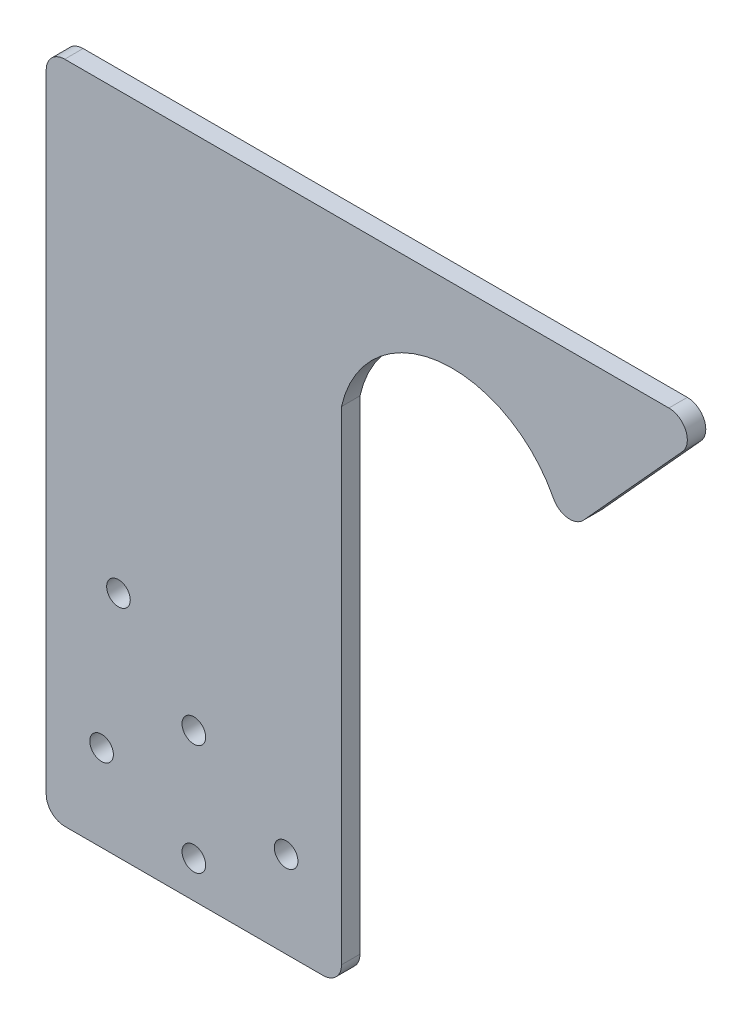
ISO-10303-21;
HEADER;
FILE_DESCRIPTION(('STEP AP214'),'2;1');
FILE_NAME('part.step','',(''),(''),'','','');
FILE_SCHEMA(('AUTOMOTIVE_DESIGN { 1 0 10303 214 1 1 1 1 }'));
ENDSEC;
DATA;
#1=APPLICATION_CONTEXT('core data for automotive mechanical design processes');
#2=APPLICATION_PROTOCOL_DEFINITION('international standard','automotive_design',2000,#1);
#3=PRODUCT_CONTEXT('',#1,'mechanical');
#4=PRODUCT('Part','Part','',(#3));
#5=PRODUCT_RELATED_PRODUCT_CATEGORY('part','',(#4));
#6=PRODUCT_DEFINITION_FORMATION('','',#4);
#7=PRODUCT_DEFINITION_CONTEXT('part definition',#1,'design');
#8=PRODUCT_DEFINITION('design','',#6,#7);
#9=PRODUCT_DEFINITION_SHAPE('','',#8);
#10=(LENGTH_UNIT() NAMED_UNIT(*) SI_UNIT(.MILLI.,.METRE.));
#11=(NAMED_UNIT(*) PLANE_ANGLE_UNIT() SI_UNIT($,.RADIAN.));
#12=(NAMED_UNIT(*) SI_UNIT($,.STERADIAN.) SOLID_ANGLE_UNIT());
#13=UNCERTAINTY_MEASURE_WITH_UNIT(LENGTH_MEASURE(1.E-05),#10,'distance_accuracy_value','');
#14=(GEOMETRIC_REPRESENTATION_CONTEXT(3) GLOBAL_UNCERTAINTY_ASSIGNED_CONTEXT((#13)) GLOBAL_UNIT_ASSIGNED_CONTEXT((#10,
#11,#12)) REPRESENTATION_CONTEXT('',''));
#15=CARTESIAN_POINT('',(0.,0.,0.));
#16=DIRECTION('',(0.,0.,1.));
#17=DIRECTION('',(1.,0.,0.));
#18=AXIS2_PLACEMENT_3D('',#15,#16,#17);
#19=CARTESIAN_POINT('',(69.85,82.0754458769866,3.175));
#20=DIRECTION('',(0.,0.,-1.));
#21=DIRECTION('',(-1.,0.,0.));
#22=AXIS2_PLACEMENT_3D('',#19,#20,#21);
#23=PLANE('',#22);
#24=DIRECTION('',(0.,-1.,0.));
#25=VECTOR('',#24,1.);
#26=CARTESIAN_POINT('',(0.,63.5,3.175));
#27=LINE('',#26,#25);
#28=CARTESIAN_POINT('',(0.,111.125,3.175));
#29=VERTEX_POINT('',#28);
#30=CARTESIAN_POINT('',(0.,3.175,3.175));
#31=VERTEX_POINT('',#30);
#32=EDGE_CURVE('E171',#29,#31,#27,.T.);
#33=ORIENTED_EDGE('',*,*,#32,.T.);
#34=CARTESIAN_POINT('',(3.175,3.175,3.175));
#35=DIRECTION('',(0.,0.,-1.));
#36=DIRECTION('',(-1.,0.,0.));
#37=AXIS2_PLACEMENT_3D('',#34,#35,#36);
#38=CIRCLE('',#37,3.175);
#39=CARTESIAN_POINT('',(3.175,0.,3.175));
#40=VERTEX_POINT('',#39);
#41=EDGE_CURVE('E198',#31,#40,#38,.F.);
#42=ORIENTED_EDGE('',*,*,#41,.T.);
#43=DIRECTION('',(1.,0.,0.));
#44=VECTOR('',#43,1.);
#45=CARTESIAN_POINT('',(0.,0.,3.175));
#46=LINE('',#45,#44);
#47=CARTESIAN_POINT('',(47.625,0.,3.175));
#48=VERTEX_POINT('',#47);
#49=EDGE_CURVE('E135',#40,#48,#46,.T.);
#50=ORIENTED_EDGE('',*,*,#49,.T.);
#51=CARTESIAN_POINT('',(47.625,3.175,3.175));
#52=DIRECTION('',(0.,0.,-1.));
#53=DIRECTION('',(-1.,0.,0.));
#54=AXIS2_PLACEMENT_3D('',#51,#52,#53);
#55=CIRCLE('',#54,3.175);
#56=CARTESIAN_POINT('',(50.8,3.175,3.175));
#57=VERTEX_POINT('',#56);
#58=EDGE_CURVE('E131',#48,#57,#55,.F.);
#59=ORIENTED_EDGE('',*,*,#58,.T.);
#60=DIRECTION('',(0.,1.,0.));
#61=VECTOR('',#60,1.);
#62=CARTESIAN_POINT('',(50.8,0.,3.175));
#63=LINE('',#62,#61);
#64=CARTESIAN_POINT('',(50.8,86.3539635761995,3.175));
#65=VERTEX_POINT('',#64);
#66=EDGE_CURVE('E122',#57,#65,#63,.T.);
#67=ORIENTED_EDGE('',*,*,#66,.T.);
#68=CARTESIAN_POINT('',(69.85,82.0754458769866,3.175));
#69=DIRECTION('',(0.,0.,-1.));
#70=DIRECTION('',(-1.,0.,0.));
#71=AXIS2_PLACEMENT_3D('',#68,#69,#70);
#72=CIRCLE('',#71,19.5245541230134);
#73=CARTESIAN_POINT('',(87.2501697565556,90.9322119993096,3.175));
#74=VERTEX_POINT('',#73);
#75=EDGE_CURVE('E127',#65,#74,#72,.T.);
#76=ORIENTED_EDGE('',*,*,#75,.T.);
#77=CARTESIAN_POINT('',(90.0797114008355,92.3724616593635,3.175));
#78=DIRECTION('',(0.,0.,-1.));
#79=DIRECTION('',(-1.,0.,0.));
#80=AXIS2_PLACEMENT_3D('',#77,#78,#79);
#81=CIRCLE('',#80,3.175);
#82=CARTESIAN_POINT('',(92.4292507615642,90.2369781561759,3.175));
#83=VERTEX_POINT('',#82);
#84=EDGE_CURVE('E195',#74,#83,#81,.F.);
#85=ORIENTED_EDGE('',*,*,#84,.T.);
#86=DIRECTION('',(0.672593229350452,0.740012397079894,0.));
#87=VECTOR('',#86,1.);
#88=CARTESIAN_POINT('',(114.3,114.3,3.175));
#89=LINE('',#88,#87);
#90=CARTESIAN_POINT('',(109.473330524035,108.989516496812,3.175));
#91=VERTEX_POINT('',#90);
#92=EDGE_CURVE('E151',#83,#91,#89,.T.);
#93=ORIENTED_EDGE('',*,*,#92,.T.);
#94=CARTESIAN_POINT('',(107.123791163306,111.125,3.175));
#95=DIRECTION('',(0.,0.,-1.));
#96=DIRECTION('',(-1.,0.,0.));
#97=AXIS2_PLACEMENT_3D('',#94,#95,#96);
#98=CIRCLE('',#97,3.175);
#99=CARTESIAN_POINT('',(107.123791163306,114.3,3.175));
#100=VERTEX_POINT('',#99);
#101=EDGE_CURVE('E60',#91,#100,#98,.F.);
#102=ORIENTED_EDGE('',*,*,#101,.T.);
#103=DIRECTION('',(-1.,0.,0.));
#104=VECTOR('',#103,1.);
#105=CARTESIAN_POINT('',(0.,114.3,3.175));
#106=LINE('',#105,#104);
#107=CARTESIAN_POINT('',(3.175,114.3,3.175));
#108=VERTEX_POINT('',#107);
#109=EDGE_CURVE('E146',#100,#108,#106,.T.);
#110=ORIENTED_EDGE('',*,*,#109,.T.);
#111=CARTESIAN_POINT('',(3.175,111.125,3.175));
#112=DIRECTION('',(0.,0.,-1.));
#113=DIRECTION('',(-1.,0.,0.));
#114=AXIS2_PLACEMENT_3D('',#111,#112,#113);
#115=CIRCLE('',#114,3.175);
#116=EDGE_CURVE('E192',#108,#29,#115,.F.);
#117=ORIENTED_EDGE('',*,*,#116,.T.);
#118=EDGE_LOOP('',(#33,#42,#50,#59,#67,#76,#85,#93,#102,#110,#117));
#119=FACE_BOUND('',#118,.T.);
#120=CARTESIAN_POINT('',(9.525,14.8697162906216,3.175));
#121=DIRECTION('',(0.,0.,1.));
#122=DIRECTION('',(1.,0.,0.));
#123=AXIS2_PLACEMENT_3D('',#120,#121,#122);
#124=CIRCLE('',#123,2.03200000000006);
#125=CARTESIAN_POINT('',(11.5570000000001,14.8697162906216,3.175));
#126=VERTEX_POINT('',#125);
#127=EDGE_CURVE('E160',#126,#126,#124,.T.);
#128=ORIENTED_EDGE('',*,*,#127,.F.);
#129=EDGE_LOOP('',(#128));
#130=FACE_BOUND('',#129,.T.);
#131=CARTESIAN_POINT('',(41.275,14.8697162906216,3.175));
#132=DIRECTION('',(0.,0.,1.));
#133=DIRECTION('',(1.,0.,0.));
#134=AXIS2_PLACEMENT_3D('',#131,#132,#133);
#135=CIRCLE('',#134,2.03200000000002);
#136=CARTESIAN_POINT('',(43.307,14.8697162906216,3.175));
#137=VERTEX_POINT('',#136);
#138=EDGE_CURVE('E244',#137,#137,#135,.T.);
#139=ORIENTED_EDGE('',*,*,#138,.F.);
#140=EDGE_LOOP('',(#139));
#141=FACE_BOUND('',#140,.T.);
#142=CARTESIAN_POINT('',(25.4,6.35,3.175));
#143=DIRECTION('',(0.,0.,1.));
#144=DIRECTION('',(1.,0.,0.));
#145=AXIS2_PLACEMENT_3D('',#142,#143,#144);
#146=CIRCLE('',#145,2.03200000000005);
#147=CARTESIAN_POINT('',(27.4320000000001,6.35,3.175));
#148=VERTEX_POINT('',#147);
#149=EDGE_CURVE('E250',#148,#148,#146,.T.);
#150=ORIENTED_EDGE('',*,*,#149,.F.);
#151=EDGE_LOOP('',(#150));
#152=FACE_BOUND('',#151,.T.);
#153=CARTESIAN_POINT('',(25.4,25.4,3.175));
#154=DIRECTION('',(0.,0.,1.));
#155=DIRECTION('',(1.,0.,0.));
#156=AXIS2_PLACEMENT_3D('',#153,#154,#155);
#157=CIRCLE('',#156,2.03200000000005);
#158=CARTESIAN_POINT('',(27.432,25.4,3.175));
#159=VERTEX_POINT('',#158);
#160=EDGE_CURVE('E256',#159,#159,#157,.T.);
#161=ORIENTED_EDGE('',*,*,#160,.F.);
#162=EDGE_LOOP('',(#161));
#163=FACE_BOUND('',#162,.T.);
#164=CARTESIAN_POINT('',(12.4320086345558,39.3547017146825,3.175));
#165=DIRECTION('',(0.,0.,1.));
#166=DIRECTION('',(1.,0.,0.));
#167=AXIS2_PLACEMENT_3D('',#164,#165,#166);
#168=CIRCLE('',#167,2.03200000000005);
#169=CARTESIAN_POINT('',(14.4640086345558,39.3547017146825,3.175));
#170=VERTEX_POINT('',#169);
#171=EDGE_CURVE('E262',#170,#170,#168,.T.);
#172=ORIENTED_EDGE('',*,*,#171,.F.);
#173=EDGE_LOOP('',(#172));
#174=FACE_BOUND('',#173,.T.);
#175=ADVANCED_FACE('F39',(#119,#130,#141,#152,#163,#174),#23,.F.);
#176=CARTESIAN_POINT('',(69.85,82.0754458769866,0.));
#177=DIRECTION('',(0.,0.,-1.));
#178=DIRECTION('',(-1.,0.,0.));
#179=AXIS2_PLACEMENT_3D('',#176,#177,#178);
#180=PLANE('',#179);
#181=CARTESIAN_POINT('',(25.4,25.4,0.));
#182=DIRECTION('',(0.,0.,1.));
#183=DIRECTION('',(1.,0.,0.));
#184=AXIS2_PLACEMENT_3D('',#181,#182,#183);
#185=CIRCLE('',#184,2.03200000000005);
#186=CARTESIAN_POINT('',(27.432,25.4,0.));
#187=VERTEX_POINT('',#186);
#188=EDGE_CURVE('E259',#187,#187,#185,.T.);
#189=ORIENTED_EDGE('',*,*,#188,.T.);
#190=EDGE_LOOP('',(#189));
#191=FACE_BOUND('',#190,.T.);
#192=CARTESIAN_POINT('',(41.275,14.8697162906216,0.));
#193=DIRECTION('',(0.,0.,1.));
#194=DIRECTION('',(1.,0.,0.));
#195=AXIS2_PLACEMENT_3D('',#192,#193,#194);
#196=CIRCLE('',#195,2.03200000000002);
#197=CARTESIAN_POINT('',(43.307,14.8697162906216,0.));
#198=VERTEX_POINT('',#197);
#199=EDGE_CURVE('E247',#198,#198,#196,.T.);
#200=ORIENTED_EDGE('',*,*,#199,.T.);
#201=EDGE_LOOP('',(#200));
#202=FACE_BOUND('',#201,.T.);
#203=DIRECTION('',(1.,0.,0.));
#204=VECTOR('',#203,1.);
#205=CARTESIAN_POINT('',(0.,0.,0.));
#206=LINE('',#205,#204);
#207=CARTESIAN_POINT('',(3.175,0.,0.));
#208=VERTEX_POINT('',#207);
#209=CARTESIAN_POINT('',(47.625,0.,0.));
#210=VERTEX_POINT('',#209);
#211=EDGE_CURVE('E157',#208,#210,#206,.T.);
#212=ORIENTED_EDGE('',*,*,#211,.F.);
#213=CARTESIAN_POINT('',(3.175,3.175,0.));
#214=DIRECTION('',(0.,0.,-1.));
#215=DIRECTION('',(-1.,0.,0.));
#216=AXIS2_PLACEMENT_3D('',#213,#214,#215);
#217=CIRCLE('',#216,3.175);
#218=CARTESIAN_POINT('',(0.,3.175,0.));
#219=VERTEX_POINT('',#218);
#220=EDGE_CURVE('E185',#208,#219,#217,.T.);
#221=ORIENTED_EDGE('',*,*,#220,.T.);
#222=DIRECTION('',(0.,-1.,0.));
#223=VECTOR('',#222,1.);
#224=CARTESIAN_POINT('',(0.,114.3,0.));
#225=LINE('',#224,#223);
#226=CARTESIAN_POINT('',(0.,111.125,0.));
#227=VERTEX_POINT('',#226);
#228=EDGE_CURVE('E169',#227,#219,#225,.T.);
#229=ORIENTED_EDGE('',*,*,#228,.F.);
#230=CARTESIAN_POINT('',(3.175,111.125,0.));
#231=DIRECTION('',(0.,0.,-1.));
#232=DIRECTION('',(-1.,0.,0.));
#233=AXIS2_PLACEMENT_3D('',#230,#231,#232);
#234=CIRCLE('',#233,3.175);
#235=CARTESIAN_POINT('',(3.175,114.3,0.));
#236=VERTEX_POINT('',#235);
#237=EDGE_CURVE('E177',#227,#236,#234,.T.);
#238=ORIENTED_EDGE('',*,*,#237,.T.);
#239=DIRECTION('',(-1.,0.,0.));
#240=VECTOR('',#239,1.);
#241=CARTESIAN_POINT('',(0.,114.3,0.));
#242=LINE('',#241,#240);
#243=CARTESIAN_POINT('',(107.123791163306,114.3,0.));
#244=VERTEX_POINT('',#243);
#245=EDGE_CURVE('E167',#244,#236,#242,.T.);
#246=ORIENTED_EDGE('',*,*,#245,.F.);
#247=CARTESIAN_POINT('',(107.123791163306,111.125,0.));
#248=DIRECTION('',(0.,0.,-1.));
#249=DIRECTION('',(-1.,0.,0.));
#250=AXIS2_PLACEMENT_3D('',#247,#248,#249);
#251=CIRCLE('',#250,3.175);
#252=CARTESIAN_POINT('',(109.473330524035,108.989516496812,0.));
#253=VERTEX_POINT('',#252);
#254=EDGE_CURVE('E179',#244,#253,#251,.T.);
#255=ORIENTED_EDGE('',*,*,#254,.T.);
#256=DIRECTION('',(0.672593229350452,0.740012397079894,0.));
#257=VECTOR('',#256,1.);
#258=CARTESIAN_POINT('',(114.3,114.3,0.));
#259=LINE('',#258,#257);
#260=CARTESIAN_POINT('',(92.4292507615642,90.2369781561759,0.));
#261=VERTEX_POINT('',#260);
#262=EDGE_CURVE('E164',#261,#253,#259,.T.);
#263=ORIENTED_EDGE('',*,*,#262,.F.);
#264=CARTESIAN_POINT('',(90.0797114008355,92.3724616593635,0.));
#265=DIRECTION('',(0.,0.,-1.));
#266=DIRECTION('',(-1.,0.,0.));
#267=AXIS2_PLACEMENT_3D('',#264,#265,#266);
#268=CIRCLE('',#267,3.175);
#269=CARTESIAN_POINT('',(87.2501697565556,90.9322119993096,0.));
#270=VERTEX_POINT('',#269);
#271=EDGE_CURVE('E181',#261,#270,#268,.T.);
#272=ORIENTED_EDGE('',*,*,#271,.T.);
#273=CARTESIAN_POINT('',(69.85,82.0754458769866,0.));
#274=DIRECTION('',(0.,0.,-1.));
#275=DIRECTION('',(-1.,0.,0.));
#276=AXIS2_PLACEMENT_3D('',#273,#274,#275);
#277=CIRCLE('',#276,19.5245541230134);
#278=CARTESIAN_POINT('',(50.8,86.3539635761995,0.));
#279=VERTEX_POINT('',#278);
#280=EDGE_CURVE('E162',#279,#270,#277,.T.);
#281=ORIENTED_EDGE('',*,*,#280,.F.);
#282=DIRECTION('',(0.,1.,0.));
#283=VECTOR('',#282,1.);
#284=CARTESIAN_POINT('',(50.8,0.,0.));
#285=LINE('',#284,#283);
#286=CARTESIAN_POINT('',(50.8,3.175,0.));
#287=VERTEX_POINT('',#286);
#288=EDGE_CURVE('E141',#287,#279,#285,.T.);
#289=ORIENTED_EDGE('',*,*,#288,.F.);
#290=CARTESIAN_POINT('',(47.625,3.175,0.));
#291=DIRECTION('',(0.,0.,-1.));
#292=DIRECTION('',(-1.,0.,0.));
#293=AXIS2_PLACEMENT_3D('',#290,#291,#292);
#294=CIRCLE('',#293,3.175);
#295=EDGE_CURVE('E183',#287,#210,#294,.T.);
#296=ORIENTED_EDGE('',*,*,#295,.T.);
#297=EDGE_LOOP('',(#212,#221,#229,#238,#246,#255,#263,#272,#281,#289,#296));
#298=FACE_BOUND('',#297,.T.);
#299=CARTESIAN_POINT('',(9.525,14.8697162906216,0.));
#300=DIRECTION('',(0.,0.,1.));
#301=DIRECTION('',(1.,0.,0.));
#302=AXIS2_PLACEMENT_3D('',#299,#300,#301);
#303=CIRCLE('',#302,2.03200000000006);
#304=CARTESIAN_POINT('',(11.5570000000001,14.8697162906216,0.));
#305=VERTEX_POINT('',#304);
#306=EDGE_CURVE('E241',#305,#305,#303,.T.);
#307=ORIENTED_EDGE('',*,*,#306,.T.);
#308=EDGE_LOOP('',(#307));
#309=FACE_BOUND('',#308,.T.);
#310=CARTESIAN_POINT('',(25.4,6.35,0.));
#311=DIRECTION('',(0.,0.,1.));
#312=DIRECTION('',(1.,0.,0.));
#313=AXIS2_PLACEMENT_3D('',#310,#311,#312);
#314=CIRCLE('',#313,2.03200000000005);
#315=CARTESIAN_POINT('',(27.4320000000001,6.35,0.));
#316=VERTEX_POINT('',#315);
#317=EDGE_CURVE('E253',#316,#316,#314,.T.);
#318=ORIENTED_EDGE('',*,*,#317,.T.);
#319=EDGE_LOOP('',(#318));
#320=FACE_BOUND('',#319,.T.);
#321=CARTESIAN_POINT('',(12.4320086345558,39.3547017146825,0.));
#322=DIRECTION('',(0.,0.,1.));
#323=DIRECTION('',(1.,0.,0.));
#324=AXIS2_PLACEMENT_3D('',#321,#322,#323);
#325=CIRCLE('',#324,2.03200000000005);
#326=CARTESIAN_POINT('',(14.4640086345558,39.3547017146825,0.));
#327=VERTEX_POINT('',#326);
#328=EDGE_CURVE('E265',#327,#327,#325,.T.);
#329=ORIENTED_EDGE('',*,*,#328,.T.);
#330=EDGE_LOOP('',(#329));
#331=FACE_BOUND('',#330,.T.);
#332=ADVANCED_FACE('F216',(#191,#202,#298,#309,#320,#331),#180,.T.);
#333=CARTESIAN_POINT('',(0.,0.,3.175));
#334=DIRECTION('',(0.,1.,0.));
#335=DIRECTION('',(0.,0.,1.));
#336=AXIS2_PLACEMENT_3D('',#333,#334,#335);
#337=PLANE('',#336);
#338=ORIENTED_EDGE('',*,*,#49,.F.);
#339=DIRECTION('',(0.,0.,-1.));
#340=VECTOR('',#339,1.);
#341=CARTESIAN_POINT('',(3.175,0.,3.175));
#342=LINE('',#341,#340);
#343=EDGE_CURVE('E174',#40,#208,#342,.T.);
#344=ORIENTED_EDGE('',*,*,#343,.T.);
#345=ORIENTED_EDGE('',*,*,#211,.T.);
#346=DIRECTION('',(0.,0.,-1.));
#347=VECTOR('',#346,1.);
#348=CARTESIAN_POINT('',(47.625,0.,3.175));
#349=LINE('',#348,#347);
#350=EDGE_CURVE('E145',#210,#48,#349,.F.);
#351=ORIENTED_EDGE('',*,*,#350,.T.);
#352=EDGE_LOOP('',(#338,#344,#345,#351));
#353=FACE_BOUND('',#352,.T.);
#354=ADVANCED_FACE('F237',(#353),#337,.F.);
#355=CARTESIAN_POINT('',(50.8,0.,3.175));
#356=DIRECTION('',(-1.,0.,0.));
#357=DIRECTION('',(0.,0.,1.));
#358=AXIS2_PLACEMENT_3D('',#355,#356,#357);
#359=PLANE('',#358);
#360=ORIENTED_EDGE('',*,*,#66,.F.);
#361=DIRECTION('',(0.,0.,-1.));
#362=VECTOR('',#361,1.);
#363=CARTESIAN_POINT('',(50.8,3.175,3.175));
#364=LINE('',#363,#362);
#365=EDGE_CURVE('E200',#57,#287,#364,.T.);
#366=ORIENTED_EDGE('',*,*,#365,.T.);
#367=ORIENTED_EDGE('',*,*,#288,.T.);
#368=DIRECTION('',(0.,0.,-1.));
#369=VECTOR('',#368,1.);
#370=CARTESIAN_POINT('',(50.8,86.3539635761995,3.175));
#371=LINE('',#370,#369);
#372=EDGE_CURVE('E138',#65,#279,#371,.T.);
#373=ORIENTED_EDGE('',*,*,#372,.F.);
#374=EDGE_LOOP('',(#360,#366,#367,#373));
#375=FACE_BOUND('',#374,.T.);
#376=ADVANCED_FACE('F139',(#375),#359,.F.);
#377=CARTESIAN_POINT('',(69.85,82.0754458769866,3.175));
#378=DIRECTION('',(0.,0.,-1.));
#379=DIRECTION('',(-1.,0.,0.));
#380=AXIS2_PLACEMENT_3D('',#377,#378,#379);
#381=CYLINDRICAL_SURFACE('',#380,19.5245541230134);
#382=ORIENTED_EDGE('',*,*,#280,.T.);
#383=DIRECTION('',(0.,0.,-1.));
#384=VECTOR('',#383,1.);
#385=CARTESIAN_POINT('',(87.2501697565556,90.9322119993096,3.175));
#386=LINE('',#385,#384);
#387=EDGE_CURVE('E150',#270,#74,#386,.F.);
#388=ORIENTED_EDGE('',*,*,#387,.T.);
#389=ORIENTED_EDGE('',*,*,#75,.F.);
#390=ORIENTED_EDGE('',*,*,#372,.T.);
#391=EDGE_LOOP('',(#382,#388,#389,#390));
#392=FACE_BOUND('',#391,.T.);
#393=ADVANCED_FACE('F148',(#392),#381,.F.);
#394=CARTESIAN_POINT('',(114.3,114.3,3.175));
#395=DIRECTION('',(-0.740012397079894,0.672593229350452,0.));
#396=DIRECTION('',(-0.672593229350452,-0.740012397079894,0.));
#397=AXIS2_PLACEMENT_3D('',#394,#395,#396);
#398=PLANE('',#397);
#399=ORIENTED_EDGE('',*,*,#92,.F.);
#400=DIRECTION('',(0.,0.,-1.));
#401=VECTOR('',#400,1.);
#402=CARTESIAN_POINT('',(92.4292507615642,90.2369781561759,3.175));
#403=LINE('',#402,#401);
#404=EDGE_CURVE('E204',#83,#261,#403,.T.);
#405=ORIENTED_EDGE('',*,*,#404,.T.);
#406=ORIENTED_EDGE('',*,*,#262,.T.);
#407=DIRECTION('',(0.,0.,-1.));
#408=VECTOR('',#407,1.);
#409=CARTESIAN_POINT('',(109.473330524035,108.989516496812,3.175));
#410=LINE('',#409,#408);
#411=EDGE_CURVE('E202',#253,#91,#410,.F.);
#412=ORIENTED_EDGE('',*,*,#411,.T.);
#413=EDGE_LOOP('',(#399,#405,#406,#412));
#414=FACE_BOUND('',#413,.T.);
#415=ADVANCED_FACE('F211',(#414),#398,.F.);
#416=CARTESIAN_POINT('',(0.,114.3,3.175));
#417=DIRECTION('',(0.,-1.,0.));
#418=DIRECTION('',(0.,0.,-1.));
#419=AXIS2_PLACEMENT_3D('',#416,#417,#418);
#420=PLANE('',#419);
#421=ORIENTED_EDGE('',*,*,#109,.F.);
#422=DIRECTION('',(0.,0.,-1.));
#423=VECTOR('',#422,1.);
#424=CARTESIAN_POINT('',(107.123791163306,114.3,3.175));
#425=LINE('',#424,#423);
#426=EDGE_CURVE('E11',#100,#244,#425,.T.);
#427=ORIENTED_EDGE('',*,*,#426,.T.);
#428=ORIENTED_EDGE('',*,*,#245,.T.);
#429=DIRECTION('',(0.,0.,-1.));
#430=VECTOR('',#429,1.);
#431=CARTESIAN_POINT('',(3.175,114.3,3.175));
#432=LINE('',#431,#430);
#433=EDGE_CURVE('E47',#236,#108,#432,.F.);
#434=ORIENTED_EDGE('',*,*,#433,.T.);
#435=EDGE_LOOP('',(#421,#427,#428,#434));
#436=FACE_BOUND('',#435,.T.);
#437=ADVANCED_FACE('F222',(#436),#420,.F.);
#438=CARTESIAN_POINT('',(0.,114.3,3.175));
#439=DIRECTION('',(1.,0.,0.));
#440=DIRECTION('',(0.,1.,0.));
#441=AXIS2_PLACEMENT_3D('',#438,#439,#440);
#442=PLANE('',#441);
#443=ORIENTED_EDGE('',*,*,#228,.T.);
#444=DIRECTION('',(0.,0.,-1.));
#445=VECTOR('',#444,1.);
#446=CARTESIAN_POINT('',(0.,3.175,3.175));
#447=LINE('',#446,#445);
#448=EDGE_CURVE('E190',#219,#31,#447,.F.);
#449=ORIENTED_EDGE('',*,*,#448,.T.);
#450=ORIENTED_EDGE('',*,*,#32,.F.);
#451=DIRECTION('',(0.,0.,-1.));
#452=VECTOR('',#451,1.);
#453=CARTESIAN_POINT('',(0.,111.125,3.175));
#454=LINE('',#453,#452);
#455=EDGE_CURVE('E187',#29,#227,#454,.T.);
#456=ORIENTED_EDGE('',*,*,#455,.T.);
#457=EDGE_LOOP('',(#443,#449,#450,#456));
#458=FACE_BOUND('',#457,.T.);
#459=ADVANCED_FACE('F229',(#458),#442,.F.);
#460=CARTESIAN_POINT('',(9.525,14.8697162906216,3.175));
#461=DIRECTION('',(0.,0.,-1.));
#462=DIRECTION('',(-1.,0.,0.));
#463=AXIS2_PLACEMENT_3D('',#460,#461,#462);
#464=CYLINDRICAL_SURFACE('',#463,2.03200000000006);
#465=ORIENTED_EDGE('',*,*,#127,.T.);
#466=EDGE_LOOP('',(#465));
#467=FACE_BOUND('',#466,.T.);
#468=ORIENTED_EDGE('',*,*,#306,.F.);
#469=EDGE_LOOP('',(#468));
#470=FACE_BOUND('',#469,.T.);
#471=ADVANCED_FACE('F283',(#467,#470),#464,.F.);
#472=CARTESIAN_POINT('',(41.275,14.8697162906216,3.175));
#473=DIRECTION('',(0.,0.,-1.));
#474=DIRECTION('',(-1.,0.,0.));
#475=AXIS2_PLACEMENT_3D('',#472,#473,#474);
#476=CYLINDRICAL_SURFACE('',#475,2.03200000000002);
#477=ORIENTED_EDGE('',*,*,#138,.T.);
#478=EDGE_LOOP('',(#477));
#479=FACE_BOUND('',#478,.T.);
#480=ORIENTED_EDGE('',*,*,#199,.F.);
#481=EDGE_LOOP('',(#480));
#482=FACE_BOUND('',#481,.T.);
#483=ADVANCED_FACE('F362',(#479,#482),#476,.F.);
#484=CARTESIAN_POINT('',(25.4,6.35,3.175));
#485=DIRECTION('',(0.,0.,-1.));
#486=DIRECTION('',(-1.,0.,0.));
#487=AXIS2_PLACEMENT_3D('',#484,#485,#486);
#488=CYLINDRICAL_SURFACE('',#487,2.03200000000005);
#489=ORIENTED_EDGE('',*,*,#149,.T.);
#490=EDGE_LOOP('',(#489));
#491=FACE_BOUND('',#490,.T.);
#492=ORIENTED_EDGE('',*,*,#317,.F.);
#493=EDGE_LOOP('',(#492));
#494=FACE_BOUND('',#493,.T.);
#495=ADVANCED_FACE('F352',(#491,#494),#488,.F.);
#496=CARTESIAN_POINT('',(25.4,25.4,3.175));
#497=DIRECTION('',(0.,0.,-1.));
#498=DIRECTION('',(-1.,0.,0.));
#499=AXIS2_PLACEMENT_3D('',#496,#497,#498);
#500=CYLINDRICAL_SURFACE('',#499,2.03200000000005);
#501=ORIENTED_EDGE('',*,*,#160,.T.);
#502=EDGE_LOOP('',(#501));
#503=FACE_BOUND('',#502,.T.);
#504=ORIENTED_EDGE('',*,*,#188,.F.);
#505=EDGE_LOOP('',(#504));
#506=FACE_BOUND('',#505,.T.);
#507=ADVANCED_FACE('F343',(#503,#506),#500,.F.);
#508=CARTESIAN_POINT('',(12.4320086345558,39.3547017146825,3.175));
#509=DIRECTION('',(0.,0.,-1.));
#510=DIRECTION('',(-1.,0.,0.));
#511=AXIS2_PLACEMENT_3D('',#508,#509,#510);
#512=CYLINDRICAL_SURFACE('',#511,2.03200000000005);
#513=ORIENTED_EDGE('',*,*,#171,.T.);
#514=EDGE_LOOP('',(#513));
#515=FACE_BOUND('',#514,.T.);
#516=ORIENTED_EDGE('',*,*,#328,.F.);
#517=EDGE_LOOP('',(#516));
#518=FACE_BOUND('',#517,.T.);
#519=ADVANCED_FACE('F271',(#515,#518),#512,.F.);
#520=CARTESIAN_POINT('',(3.175,3.175,3.175));
#521=DIRECTION('',(0.,0.,-1.));
#522=DIRECTION('',(-1.,0.,0.));
#523=AXIS2_PLACEMENT_3D('',#520,#521,#522);
#524=CYLINDRICAL_SURFACE('',#523,3.175);
#525=ORIENTED_EDGE('',*,*,#41,.F.);
#526=ORIENTED_EDGE('',*,*,#448,.F.);
#527=ORIENTED_EDGE('',*,*,#220,.F.);
#528=ORIENTED_EDGE('',*,*,#343,.F.);
#529=EDGE_LOOP('',(#525,#526,#527,#528));
#530=FACE_BOUND('',#529,.T.);
#531=ADVANCED_FACE('F234',(#530),#524,.T.);
#532=CARTESIAN_POINT('',(47.625,3.175,3.175));
#533=DIRECTION('',(0.,0.,-1.));
#534=DIRECTION('',(-1.,0.,0.));
#535=AXIS2_PLACEMENT_3D('',#532,#533,#534);
#536=CYLINDRICAL_SURFACE('',#535,3.175);
#537=ORIENTED_EDGE('',*,*,#58,.F.);
#538=ORIENTED_EDGE('',*,*,#350,.F.);
#539=ORIENTED_EDGE('',*,*,#295,.F.);
#540=ORIENTED_EDGE('',*,*,#365,.F.);
#541=EDGE_LOOP('',(#537,#538,#539,#540));
#542=FACE_BOUND('',#541,.T.);
#543=ADVANCED_FACE('F300',(#542),#536,.T.);
#544=CARTESIAN_POINT('',(90.0797114008355,92.3724616593635,3.175));
#545=DIRECTION('',(0.,0.,-1.));
#546=DIRECTION('',(-1.,0.,0.));
#547=AXIS2_PLACEMENT_3D('',#544,#545,#546);
#548=CYLINDRICAL_SURFACE('',#547,3.175);
#549=ORIENTED_EDGE('',*,*,#84,.F.);
#550=ORIENTED_EDGE('',*,*,#387,.F.);
#551=ORIENTED_EDGE('',*,*,#271,.F.);
#552=ORIENTED_EDGE('',*,*,#404,.F.);
#553=EDGE_LOOP('',(#549,#550,#551,#552));
#554=FACE_BOUND('',#553,.T.);
#555=ADVANCED_FACE('F303',(#554),#548,.T.);
#556=CARTESIAN_POINT('',(107.123791163306,111.125,3.175));
#557=DIRECTION('',(0.,0.,-1.));
#558=DIRECTION('',(-1.,0.,0.));
#559=AXIS2_PLACEMENT_3D('',#556,#557,#558);
#560=CYLINDRICAL_SURFACE('',#559,3.175);
#561=ORIENTED_EDGE('',*,*,#101,.F.);
#562=ORIENTED_EDGE('',*,*,#411,.F.);
#563=ORIENTED_EDGE('',*,*,#254,.F.);
#564=ORIENTED_EDGE('',*,*,#426,.F.);
#565=EDGE_LOOP('',(#561,#562,#563,#564));
#566=FACE_BOUND('',#565,.T.);
#567=ADVANCED_FACE('F221',(#566),#560,.T.);
#568=CARTESIAN_POINT('',(3.175,111.125,3.175));
#569=DIRECTION('',(0.,0.,-1.));
#570=DIRECTION('',(-1.,0.,0.));
#571=AXIS2_PLACEMENT_3D('',#568,#569,#570);
#572=CYLINDRICAL_SURFACE('',#571,3.175);
#573=ORIENTED_EDGE('',*,*,#116,.F.);
#574=ORIENTED_EDGE('',*,*,#433,.F.);
#575=ORIENTED_EDGE('',*,*,#237,.F.);
#576=ORIENTED_EDGE('',*,*,#455,.F.);
#577=EDGE_LOOP('',(#573,#574,#575,#576));
#578=FACE_BOUND('',#577,.T.);
#579=ADVANCED_FACE('F41',(#578),#572,.T.);
#580=CLOSED_SHELL('',(#175,#332,#354,#376,#393,#415,#437,#459,#471,#483,#495,#507,#519,#531,
#543,#555,#567,#579));
#581=MANIFOLD_SOLID_BREP('B2',#580);
#582=ADVANCED_BREP_SHAPE_REPRESENTATION('',(#18,#581),#14);
#583=SHAPE_DEFINITION_REPRESENTATION(#9,#582);
ENDSEC;
END-ISO-10303-21;
